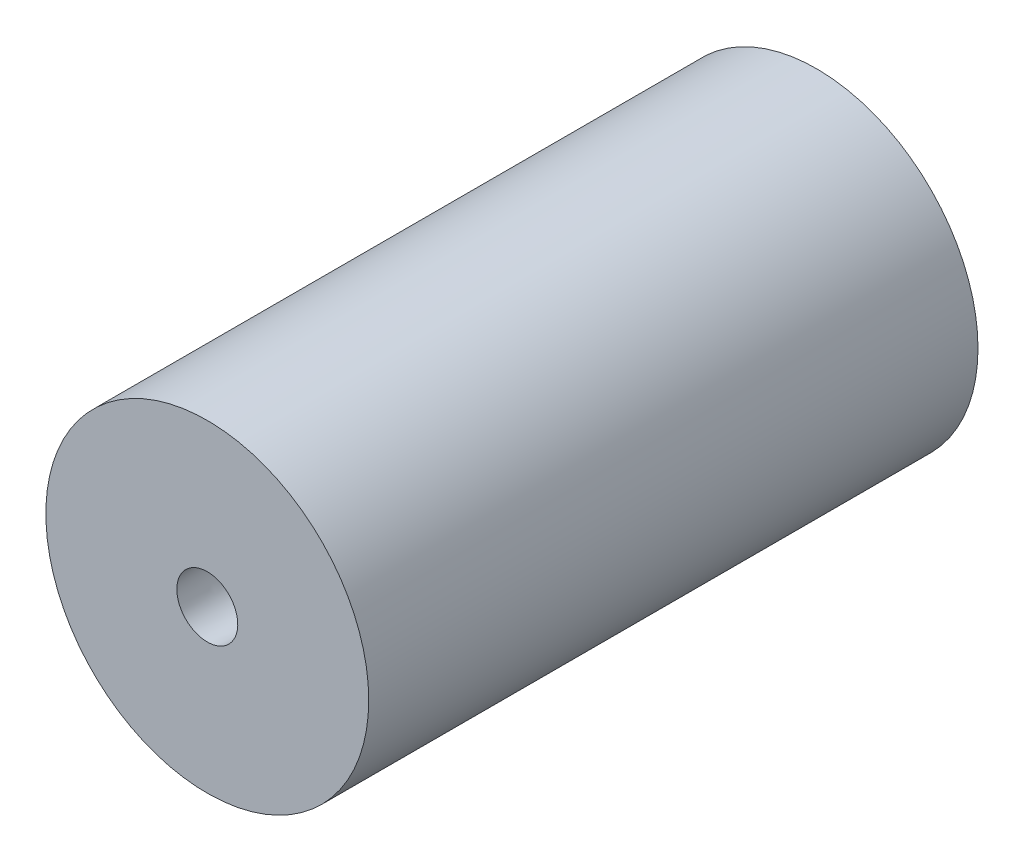
ISO-10303-21;
HEADER;
FILE_DESCRIPTION(('STEP AP214'),'2;1');
FILE_NAME('part.step','',(''),(''),'','','');
FILE_SCHEMA(('AUTOMOTIVE_DESIGN { 1 0 10303 214 1 1 1 1 }'));
ENDSEC;
DATA;
#1=APPLICATION_CONTEXT('core data for automotive mechanical design processes');
#2=APPLICATION_PROTOCOL_DEFINITION('international standard','automotive_design',2000,#1);
#3=PRODUCT_CONTEXT('',#1,'mechanical');
#4=PRODUCT('Part','Part','',(#3));
#5=PRODUCT_RELATED_PRODUCT_CATEGORY('part','',(#4));
#6=PRODUCT_DEFINITION_FORMATION('','',#4);
#7=PRODUCT_DEFINITION_CONTEXT('part definition',#1,'design');
#8=PRODUCT_DEFINITION('design','',#6,#7);
#9=PRODUCT_DEFINITION_SHAPE('','',#8);
#10=(LENGTH_UNIT() NAMED_UNIT(*) SI_UNIT(.MILLI.,.METRE.));
#11=(NAMED_UNIT(*) PLANE_ANGLE_UNIT() SI_UNIT($,.RADIAN.));
#12=(NAMED_UNIT(*) SI_UNIT($,.STERADIAN.) SOLID_ANGLE_UNIT());
#13=UNCERTAINTY_MEASURE_WITH_UNIT(LENGTH_MEASURE(1.E-05),#10,'distance_accuracy_value','');
#14=(GEOMETRIC_REPRESENTATION_CONTEXT(3) GLOBAL_UNCERTAINTY_ASSIGNED_CONTEXT((#13)) GLOBAL_UNIT_ASSIGNED_CONTEXT((#10,
#11,#12)) REPRESENTATION_CONTEXT('',''));
#15=CARTESIAN_POINT('',(0.,0.,0.));
#16=DIRECTION('',(0.,0.,1.));
#17=DIRECTION('',(1.,0.,0.));
#18=AXIS2_PLACEMENT_3D('',#15,#16,#17);
#19=CARTESIAN_POINT('',(0.,0.,10.));
#20=DIRECTION('',(0.,0.,-1.));
#21=DIRECTION('',(-1.,0.,0.));
#22=AXIS2_PLACEMENT_3D('',#19,#20,#21);
#23=CYLINDRICAL_SURFACE('',#22,2.65);
#24=CARTESIAN_POINT('',(0.,0.,10.));
#25=DIRECTION('',(0.,0.,1.));
#26=DIRECTION('',(1.,0.,0.));
#27=AXIS2_PLACEMENT_3D('',#24,#25,#26);
#28=CIRCLE('',#27,2.65);
#29=CARTESIAN_POINT('',(2.65,0.,10.));
#30=VERTEX_POINT('',#29);
#31=EDGE_CURVE('E11',#30,#30,#28,.T.);
#32=ORIENTED_EDGE('',*,*,#31,.F.);
#33=EDGE_LOOP('',(#32));
#34=FACE_BOUND('',#33,.T.);
#35=CARTESIAN_POINT('',(0.,0.,0.));
#36=DIRECTION('',(0.,0.,1.));
#37=DIRECTION('',(1.,0.,0.));
#38=AXIS2_PLACEMENT_3D('',#35,#36,#37);
#39=CIRCLE('',#38,2.65);
#40=CARTESIAN_POINT('',(2.65,0.,0.));
#41=VERTEX_POINT('',#40);
#42=EDGE_CURVE('E40',#41,#41,#39,.T.);
#43=ORIENTED_EDGE('',*,*,#42,.T.);
#44=EDGE_LOOP('',(#43));
#45=FACE_BOUND('',#44,.T.);
#46=ADVANCED_FACE('F37',(#34,#45),#23,.T.);
#47=CARTESIAN_POINT('',(0.,0.,10.));
#48=DIRECTION('',(0.,0.,1.));
#49=DIRECTION('',(1.,0.,0.));
#50=AXIS2_PLACEMENT_3D('',#47,#48,#49);
#51=PLANE('',#50);
#52=CARTESIAN_POINT('',(0.,0.,10.));
#53=DIRECTION('',(0.,0.,1.));
#54=DIRECTION('',(1.,0.,0.));
#55=AXIS2_PLACEMENT_3D('',#52,#53,#54);
#56=CIRCLE('',#55,0.5);
#57=CARTESIAN_POINT('',(0.462299616030942,-0.190470640828565,10.));
#58=VERTEX_POINT('',#57);
#59=EDGE_CURVE('E47',#58,#58,#56,.T.);
#60=ORIENTED_EDGE('',*,*,#59,.F.);
#61=EDGE_LOOP('',(#60));
#62=FACE_BOUND('',#61,.T.);
#63=ORIENTED_EDGE('',*,*,#31,.T.);
#64=EDGE_LOOP('',(#63));
#65=FACE_BOUND('',#64,.T.);
#66=ADVANCED_FACE('F61',(#62,#65),#51,.T.);
#67=CARTESIAN_POINT('',(0.,0.,0.));
#68=DIRECTION('',(0.,0.,1.));
#69=DIRECTION('',(1.,0.,0.));
#70=AXIS2_PLACEMENT_3D('',#67,#68,#69);
#71=PLANE('',#70);
#72=CARTESIAN_POINT('',(0.,0.,0.));
#73=DIRECTION('',(0.,0.,-1.));
#74=DIRECTION('',(-1.,0.,0.));
#75=AXIS2_PLACEMENT_3D('',#72,#73,#74);
#76=CIRCLE('',#75,1.);
#77=CARTESIAN_POINT('',(0.957982837841806,0.286825526061682,0.));
#78=VERTEX_POINT('',#77);
#79=EDGE_CURVE('E51',#78,#78,#76,.T.);
#80=ORIENTED_EDGE('',*,*,#79,.F.);
#81=EDGE_LOOP('',(#80));
#82=FACE_BOUND('',#81,.T.);
#83=ORIENTED_EDGE('',*,*,#42,.F.);
#84=EDGE_LOOP('',(#83));
#85=FACE_BOUND('',#84,.T.);
#86=ADVANCED_FACE('F58',(#82,#85),#71,.F.);
#87=CARTESIAN_POINT('',(0.957982837841806,0.286825526061682,0.));
#88=CARTESIAN_POINT('',(0.462299616030942,-0.190470640828565,10.));
#89=CARTESIAN_POINT('',(0.384331785718441,2.20279120174529,0.));
#90=CARTESIAN_POINT('',(0.843240897688071,0.734128591233318,10.));
#91=CARTESIAN_POINT('',(-1.53163388996517,1.62914014962193,0.));
#92=CARTESIAN_POINT('',(-0.0813583343738127,1.11506987289045,10.));
#93=CARTESIAN_POINT('',(-0.957982837841806,-0.286825526061682,0.));
#94=CARTESIAN_POINT('',(-0.462299616030942,0.190470640828564,10.));
#95=CARTESIAN_POINT('',(-0.384331785718441,-2.20279120174529,0.));
#96=CARTESIAN_POINT('',(-0.84324089768807,-0.734128591233319,10.));
#97=CARTESIAN_POINT('',(1.53163388996517,-1.62914014962193,0.));
#98=CARTESIAN_POINT('',(0.0813583343738125,-1.11506987289045,10.));
#99=CARTESIAN_POINT('',(0.957982837841806,0.286825526061682,0.));
#100=CARTESIAN_POINT('',(0.462299616030942,-0.190470640828565,10.));
#101=(BOUNDED_SURFACE() B_SPLINE_SURFACE(3,1,((#87,#88),(#89,#90),(#91,#92),(#93,#94),(#95,#96),
(#97,#98),(#99,#100)),.UNSPECIFIED.,.T.,.F.,.F.) B_SPLINE_SURFACE_WITH_KNOTS((4,3,4),(2,2),(0.,
0.5,1.),(0.,1.),.UNSPECIFIED.) GEOMETRIC_REPRESENTATION_ITEM() RATIONAL_B_SPLINE_SURFACE(((1.,
1.),(0.333333333333333,0.333333333333333),(0.333333333333333,0.333333333333333),(1.,1.),
(0.333333333333333,0.333333333333333),(0.333333333333333,0.333333333333333),(1.,1.))) REPRESENTATION_ITEM('') SURFACE());
#102=CARTESIAN_POINT('',(0.957982837841806,0.286825526061682,0.));
#103=CARTESIAN_POINT('',(0.952819470947943,0.281853690989909,0.104166666666667));
#104=CARTESIAN_POINT('',(0.947656104054079,0.276881855918136,0.208333333333333));
#105=CARTESIAN_POINT('',(0.937329370266353,0.266938185774589,0.416666666666667));
#106=CARTESIAN_POINT('',(0.93216600337249,0.261966350702815,0.520833333333333));
#107=CARTESIAN_POINT('',(0.921839269584763,0.252022680559269,0.729166666666667));
#108=CARTESIAN_POINT('',(0.9166759026909,0.247050845487495,0.833333333333333));
#109=CARTESIAN_POINT('',(0.906349168903174,0.237107175343948,1.04166666666667));
#110=CARTESIAN_POINT('',(0.901185802009311,0.232135340272175,1.14583333333333));
#111=CARTESIAN_POINT('',(0.890859068221584,0.222191670128628,1.35416666666667));
#112=CARTESIAN_POINT('',(0.885695701327721,0.217219835056855,1.45833333333333));
#113=CARTESIAN_POINT('',(0.875368967539995,0.207276164913308,1.66666666666667));
#114=CARTESIAN_POINT('',(0.870205600646132,0.202304329841534,1.77083333333333));
#115=CARTESIAN_POINT('',(0.859878866858406,0.192360659697988,1.97916666666667));
#116=CARTESIAN_POINT('',(0.854715499964542,0.187388824626214,2.08333333333333));
#117=CARTESIAN_POINT('',(0.844388766176816,0.177445154482667,2.29166666666667));
#118=CARTESIAN_POINT('',(0.839225399282953,0.172473319410894,2.39583333333333));
#119=CARTESIAN_POINT('',(0.828898665495227,0.162529649267347,2.60416666666667));
#120=CARTESIAN_POINT('',(0.823735298601363,0.157557814195574,2.70833333333333));
#121=CARTESIAN_POINT('',(0.813408564813637,0.147614144052027,2.91666666666667));
#122=CARTESIAN_POINT('',(0.808245197919774,0.142642308980254,3.02083333333333));
#123=CARTESIAN_POINT('',(0.797918464132047,0.132698638836707,3.22916666666667));
#124=CARTESIAN_POINT('',(0.792755097238184,0.127726803764933,3.33333333333333));
#125=CARTESIAN_POINT('',(0.782428363450458,0.117783133621387,3.54166666666667));
#126=CARTESIAN_POINT('',(0.777264996556595,0.112811298549613,3.64583333333333));
#127=CARTESIAN_POINT('',(0.766938262768868,0.102867628406066,3.85416666666667));
#128=CARTESIAN_POINT('',(0.761774895875005,0.097895793334293,3.95833333333333));
#129=CARTESIAN_POINT('',(0.751448162087279,0.0879521231907461,4.16666666666667));
#130=CARTESIAN_POINT('',(0.746284795193416,0.0829802881189727,4.27083333333333));
#131=CARTESIAN_POINT('',(0.735958061405689,0.0730366179754259,4.47916666666667));
#132=CARTESIAN_POINT('',(0.730794694511826,0.0680647829036525,4.58333333333333));
#133=CARTESIAN_POINT('',(0.7204679607241,0.0581211127601057,4.79166666666667));
#134=CARTESIAN_POINT('',(0.715304593830237,0.0531492776883323,4.89583333333333));
#135=CARTESIAN_POINT('',(0.704977860042511,0.0432056075447855,5.10416666666667));
#136=CARTESIAN_POINT('',(0.699814493148647,0.0382337724730121,5.20833333333333));
#137=CARTESIAN_POINT('',(0.689487759360921,0.0282901023294653,5.41666666666667));
#138=CARTESIAN_POINT('',(0.684324392467058,0.0233182672576919,5.52083333333333));
#139=CARTESIAN_POINT('',(0.673997658679331,0.0133745971141451,5.72916666666667));
#140=CARTESIAN_POINT('',(0.668834291785468,0.00840276204237165,5.83333333333333));
#141=CARTESIAN_POINT('',(0.658507557997742,-0.00154090810117516,6.04166666666667));
#142=CARTESIAN_POINT('',(0.653344191103879,-0.00651274317294856,6.14583333333333));
#143=CARTESIAN_POINT('',(0.643017457316152,-0.0164564133164954,6.35416666666667));
#144=CARTESIAN_POINT('',(0.637854090422289,-0.0214282483882688,6.45833333333333));
#145=CARTESIAN_POINT('',(0.627527356634563,-0.0313719185318156,6.66666666666667));
#146=CARTESIAN_POINT('',(0.6223639897407,-0.036343753603589,6.77083333333333));
#147=CARTESIAN_POINT('',(0.612037255952973,-0.0462874237471358,6.97916666666667));
#148=CARTESIAN_POINT('',(0.60687388905911,-0.0512592588189092,7.08333333333333));
#149=CARTESIAN_POINT('',(0.596547155271384,-0.061202928962456,7.29166666666667));
#150=CARTESIAN_POINT('',(0.591383788377521,-0.0661747640342294,7.39583333333333));
#151=CARTESIAN_POINT('',(0.581057054589794,-0.0761184341777762,7.60416666666667));
#152=CARTESIAN_POINT('',(0.575893687695931,-0.0810902692495496,7.70833333333333));
#153=CARTESIAN_POINT('',(0.565566953908205,-0.0910339393930964,7.91666666666667));
#154=CARTESIAN_POINT('',(0.560403587014342,-0.0960057744648698,8.02083333333333));
#155=CARTESIAN_POINT('',(0.550076853226615,-0.105949444608417,8.22916666666667));
#156=CARTESIAN_POINT('',(0.544913486332752,-0.11092127968019,8.33333333333333));
#157=CARTESIAN_POINT('',(0.534586752545026,-0.120864949823737,8.54166666666667));
#158=CARTESIAN_POINT('',(0.529423385651163,-0.12583678489551,8.64583333333333));
#159=CARTESIAN_POINT('',(0.519096651863436,-0.135780455039057,8.85416666666667));
#160=CARTESIAN_POINT('',(0.513933284969573,-0.14075229011083,8.95833333333333));
#161=CARTESIAN_POINT('',(0.503606551181847,-0.150695960254377,9.16666666666667));
#162=CARTESIAN_POINT('',(0.498443184287984,-0.155667795326151,9.27083333333333));
#163=CARTESIAN_POINT('',(0.488116450500257,-0.165611465469698,9.47916666666667));
#164=CARTESIAN_POINT('',(0.482953083606394,-0.170583300541471,9.58333333333333));
#165=CARTESIAN_POINT('',(0.472626349818668,-0.180526970685018,9.79166666666667));
#166=CARTESIAN_POINT('',(0.467462982924805,-0.185498805756791,9.89583333333333));
#167=CARTESIAN_POINT('',(0.462299616030942,-0.190470640828565,10.));
#168=B_SPLINE_CURVE_WITH_KNOTS('',3,(#102,#103,#104,#105,#106,#107,#108,#109,#110,#111,#112,
#113,#114,#115,#116,#117,#118,#119,#120,#121,#122,#123,#124,#125,#126,#127,#128,#129,#130,#131,
#132,#133,#134,#135,#136,#137,#138,#139,#140,#141,#142,#143,#144,#145,#146,#147,#148,#149,#150,
#151,#152,#153,#154,#155,#156,#157,#158,#159,#160,#161,#162,#163,#164,#165,#166,#167),
.UNSPECIFIED.,.F.,.F.,(4,2,2,2,2,2,2,2,2,2,2,2,2,2,2,2,2,2,2,2,2,2,2,2,2,2,2,2,2,2,2,2,4),(0.,
0.313238991051488,0.626477982102976,0.939716973154463,1.25295596420595,1.56619495525744,
1.87943394630893,2.19267293736041,2.5059119284119,2.81915091946339,3.13238991051488,
3.44562890156637,3.75886789261785,4.07210688366934,4.38534587472083,4.69858486577232,
5.0118238568238,5.32506284787529,5.63830183892678,5.95154082997827,6.26477982102975,
6.57801881208124,6.89125780313273,7.20449679418422,7.5177357852357,7.83097477628719,
8.14421376733868,8.45745275839017,8.77069174944165,9.08393074049314,9.39716973154463,
9.71040872259612,10.0236477136476),.UNSPECIFIED.);
#169=EDGE_CURVE('BSEAM55',#78,#58,#168,.T.);
#170=ORIENTED_EDGE('',*,*,#79,.T.);
#171=ORIENTED_EDGE('',*,*,#59,.T.);
#172=ORIENTED_EDGE('',*,*,#169,.T.);
#173=ORIENTED_EDGE('',*,*,#169,.F.);
#174=EDGE_LOOP('',(#170,#172,#171,#173));
#175=FACE_BOUND('',#174,.T.);
#176=ADVANCED_FACE('F55',(#175),#101,.F.);
#177=CLOSED_SHELL('',(#46,#66,#86,#176));
#178=MANIFOLD_SOLID_BREP('B2',#177);
#179=ADVANCED_BREP_SHAPE_REPRESENTATION('',(#18,#178),#14);
#180=SHAPE_DEFINITION_REPRESENTATION(#9,#179);
ENDSEC;
END-ISO-10303-21;
